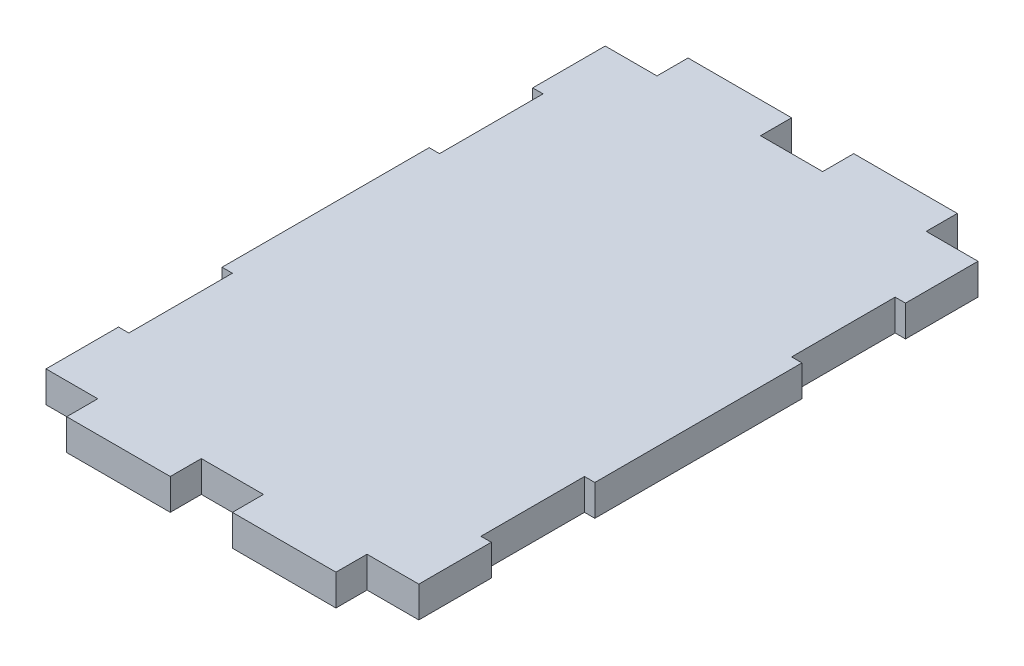
ISO-10303-21;
HEADER;
FILE_DESCRIPTION(('STEP AP214'),'2;1');
FILE_NAME('part.step','',(''),(''),'','','');
FILE_SCHEMA(('AUTOMOTIVE_DESIGN { 1 0 10303 214 1 1 1 1 }'));
ENDSEC;
DATA;
#1=APPLICATION_CONTEXT('core data for automotive mechanical design processes');
#2=APPLICATION_PROTOCOL_DEFINITION('international standard','automotive_design',2000,#1);
#3=PRODUCT_CONTEXT('',#1,'mechanical');
#4=PRODUCT('Part','Part','',(#3));
#5=PRODUCT_RELATED_PRODUCT_CATEGORY('part','',(#4));
#6=PRODUCT_DEFINITION_FORMATION('','',#4);
#7=PRODUCT_DEFINITION_CONTEXT('part definition',#1,'design');
#8=PRODUCT_DEFINITION('design','',#6,#7);
#9=PRODUCT_DEFINITION_SHAPE('','',#8);
#10=(LENGTH_UNIT() NAMED_UNIT(*) SI_UNIT(.MILLI.,.METRE.));
#11=(NAMED_UNIT(*) PLANE_ANGLE_UNIT() SI_UNIT($,.RADIAN.));
#12=(NAMED_UNIT(*) SI_UNIT($,.STERADIAN.) SOLID_ANGLE_UNIT());
#13=UNCERTAINTY_MEASURE_WITH_UNIT(LENGTH_MEASURE(1.E-05),#10,'distance_accuracy_value','');
#14=(GEOMETRIC_REPRESENTATION_CONTEXT(3) GLOBAL_UNCERTAINTY_ASSIGNED_CONTEXT((#13)) GLOBAL_UNIT_ASSIGNED_CONTEXT((#10,
#11,#12)) REPRESENTATION_CONTEXT('',''));
#15=CARTESIAN_POINT('',(0.,0.,0.));
#16=DIRECTION('',(0.,0.,1.));
#17=DIRECTION('',(1.,0.,0.));
#18=AXIS2_PLACEMENT_3D('',#15,#16,#17);
#19=CARTESIAN_POINT('',(0.,3.,-3.));
#20=DIRECTION('',(0.,0.,-1.));
#21=DIRECTION('',(-1.,0.,0.));
#22=AXIS2_PLACEMENT_3D('',#19,#20,#21);
#23=PLANE('',#22);
#24=DIRECTION('',(1.,0.,0.));
#25=VECTOR('',#24,1.);
#26=CARTESIAN_POINT('',(0.,0.,-3.));
#27=LINE('',#26,#25);
#28=CARTESIAN_POINT('',(0.,0.,-3.));
#29=VERTEX_POINT('',#28);
#30=CARTESIAN_POINT('',(5.,0.,-3.));
#31=VERTEX_POINT('',#30);
#32=EDGE_CURVE('E302',#29,#31,#27,.T.);
#33=ORIENTED_EDGE('',*,*,#32,.T.);
#34=DIRECTION('',(0.,-1.,0.));
#35=VECTOR('',#34,1.);
#36=CARTESIAN_POINT('',(5.,3.,-3.));
#37=LINE('',#36,#35);
#38=CARTESIAN_POINT('',(5.,3.,-3.));
#39=VERTEX_POINT('',#38);
#40=EDGE_CURVE('E11',#39,#31,#37,.T.);
#41=ORIENTED_EDGE('',*,*,#40,.F.);
#42=DIRECTION('',(1.,0.,0.));
#43=VECTOR('',#42,1.);
#44=CARTESIAN_POINT('',(0.,3.,-3.));
#45=LINE('',#44,#43);
#46=CARTESIAN_POINT('',(0.,3.,-3.));
#47=VERTEX_POINT('',#46);
#48=EDGE_CURVE('E391',#47,#39,#45,.T.);
#49=ORIENTED_EDGE('',*,*,#48,.F.);
#50=DIRECTION('',(0.,-1.,0.));
#51=VECTOR('',#50,1.);
#52=CARTESIAN_POINT('',(0.,3.,-3.));
#53=LINE('',#52,#51);
#54=EDGE_CURVE('E52',#47,#29,#53,.T.);
#55=ORIENTED_EDGE('',*,*,#54,.T.);
#56=EDGE_LOOP('',(#33,#41,#49,#55));
#57=FACE_BOUND('',#56,.T.);
#58=ADVANCED_FACE('F35',(#57),#23,.F.);
#59=CARTESIAN_POINT('',(5.,3.,0.));
#60=DIRECTION('',(1.,0.,0.));
#61=DIRECTION('',(0.,0.,-1.));
#62=AXIS2_PLACEMENT_3D('',#59,#60,#61);
#63=PLANE('',#62);
#64=DIRECTION('',(0.,0.,1.));
#65=VECTOR('',#64,1.);
#66=CARTESIAN_POINT('',(5.,0.,0.));
#67=LINE('',#66,#65);
#68=CARTESIAN_POINT('',(5.,0.,0.));
#69=VERTEX_POINT('',#68);
#70=EDGE_CURVE('E304',#31,#69,#67,.T.);
#71=ORIENTED_EDGE('',*,*,#70,.T.);
#72=DIRECTION('',(0.,-1.,0.));
#73=VECTOR('',#72,1.);
#74=CARTESIAN_POINT('',(5.,3.,0.));
#75=LINE('',#74,#73);
#76=CARTESIAN_POINT('',(5.,3.,0.));
#77=VERTEX_POINT('',#76);
#78=EDGE_CURVE('E44',#77,#69,#75,.T.);
#79=ORIENTED_EDGE('',*,*,#78,.F.);
#80=DIRECTION('',(0.,0.,1.));
#81=VECTOR('',#80,1.);
#82=CARTESIAN_POINT('',(5.,3.,0.));
#83=LINE('',#82,#81);
#84=EDGE_CURVE('E174',#39,#77,#83,.T.);
#85=ORIENTED_EDGE('',*,*,#84,.F.);
#86=ORIENTED_EDGE('',*,*,#40,.T.);
#87=EDGE_LOOP('',(#71,#79,#85,#86));
#88=FACE_BOUND('',#87,.T.);
#89=ADVANCED_FACE('F37',(#88),#63,.F.);
#90=CARTESIAN_POINT('',(0.,3.,0.));
#91=DIRECTION('',(0.,0.,-1.));
#92=DIRECTION('',(-1.,0.,0.));
#93=AXIS2_PLACEMENT_3D('',#90,#91,#92);
#94=PLANE('',#93);
#95=DIRECTION('',(1.,0.,0.));
#96=VECTOR('',#95,1.);
#97=CARTESIAN_POINT('',(0.,0.,0.));
#98=LINE('',#97,#96);
#99=CARTESIAN_POINT('',(15.,0.,0.));
#100=VERTEX_POINT('',#99);
#101=EDGE_CURVE('E307',#69,#100,#98,.T.);
#102=ORIENTED_EDGE('',*,*,#101,.T.);
#103=DIRECTION('',(0.,-1.,0.));
#104=VECTOR('',#103,1.);
#105=CARTESIAN_POINT('',(15.,3.,0.));
#106=LINE('',#105,#104);
#107=CARTESIAN_POINT('',(15.,3.,0.));
#108=VERTEX_POINT('',#107);
#109=EDGE_CURVE('E459',#108,#100,#106,.T.);
#110=ORIENTED_EDGE('',*,*,#109,.F.);
#111=DIRECTION('',(1.,0.,0.));
#112=VECTOR('',#111,1.);
#113=CARTESIAN_POINT('',(0.,3.,0.));
#114=LINE('',#113,#112);
#115=EDGE_CURVE('E466',#77,#108,#114,.T.);
#116=ORIENTED_EDGE('',*,*,#115,.F.);
#117=ORIENTED_EDGE('',*,*,#78,.T.);
#118=EDGE_LOOP('',(#102,#110,#116,#117));
#119=FACE_BOUND('',#118,.T.);
#120=ADVANCED_FACE('F464',(#119),#94,.F.);
#121=CARTESIAN_POINT('',(15.,3.,0.));
#122=DIRECTION('',(1.,0.,0.));
#123=DIRECTION('',(0.,0.,-1.));
#124=AXIS2_PLACEMENT_3D('',#121,#122,#123);
#125=PLANE('',#124);
#126=DIRECTION('',(0.,0.,1.));
#127=VECTOR('',#126,1.);
#128=CARTESIAN_POINT('',(15.,0.,0.));
#129=LINE('',#128,#127);
#130=CARTESIAN_POINT('',(15.,0.,-3.));
#131=VERTEX_POINT('',#130);
#132=EDGE_CURVE('E310',#131,#100,#129,.T.);
#133=ORIENTED_EDGE('',*,*,#132,.F.);
#134=DIRECTION('',(0.,-1.,0.));
#135=VECTOR('',#134,1.);
#136=CARTESIAN_POINT('',(15.,3.,-3.));
#137=LINE('',#136,#135);
#138=CARTESIAN_POINT('',(15.,3.,-3.));
#139=VERTEX_POINT('',#138);
#140=EDGE_CURVE('E457',#139,#131,#137,.T.);
#141=ORIENTED_EDGE('',*,*,#140,.F.);
#142=DIRECTION('',(0.,0.,1.));
#143=VECTOR('',#142,1.);
#144=CARTESIAN_POINT('',(15.,3.,0.));
#145=LINE('',#144,#143);
#146=EDGE_CURVE('E477',#139,#108,#145,.T.);
#147=ORIENTED_EDGE('',*,*,#146,.T.);
#148=ORIENTED_EDGE('',*,*,#109,.T.);
#149=EDGE_LOOP('',(#133,#141,#147,#148));
#150=FACE_BOUND('',#149,.T.);
#151=ADVANCED_FACE('F473',(#150),#125,.T.);
#152=CARTESIAN_POINT('',(21.,0.,-3.));
#153=VERTEX_POINT('',#152);
#154=EDGE_CURVE('E305',#131,#153,#27,.T.);
#155=ORIENTED_EDGE('',*,*,#154,.T.);
#156=DIRECTION('',(0.,-1.,0.));
#157=VECTOR('',#156,1.);
#158=CARTESIAN_POINT('',(21.,3.,-3.));
#159=LINE('',#158,#157);
#160=CARTESIAN_POINT('',(21.,3.,-3.));
#161=VERTEX_POINT('',#160);
#162=EDGE_CURVE('E454',#161,#153,#159,.T.);
#163=ORIENTED_EDGE('',*,*,#162,.F.);
#164=EDGE_CURVE('E478',#139,#161,#45,.T.);
#165=ORIENTED_EDGE('',*,*,#164,.F.);
#166=ORIENTED_EDGE('',*,*,#140,.T.);
#167=EDGE_LOOP('',(#155,#163,#165,#166));
#168=FACE_BOUND('',#167,.T.);
#169=ADVANCED_FACE('F566',(#168),#23,.F.);
#170=CARTESIAN_POINT('',(21.,3.,0.));
#171=DIRECTION('',(1.,0.,0.));
#172=DIRECTION('',(0.,0.,-1.));
#173=AXIS2_PLACEMENT_3D('',#170,#171,#172);
#174=PLANE('',#173);
#175=DIRECTION('',(0.,0.,1.));
#176=VECTOR('',#175,1.);
#177=CARTESIAN_POINT('',(21.,0.,0.));
#178=LINE('',#177,#176);
#179=CARTESIAN_POINT('',(21.,0.,0.));
#180=VERTEX_POINT('',#179);
#181=EDGE_CURVE('E313',#153,#180,#178,.T.);
#182=ORIENTED_EDGE('',*,*,#181,.T.);
#183=DIRECTION('',(0.,-1.,0.));
#184=VECTOR('',#183,1.);
#185=CARTESIAN_POINT('',(21.,3.,0.));
#186=LINE('',#185,#184);
#187=CARTESIAN_POINT('',(21.,3.,0.));
#188=VERTEX_POINT('',#187);
#189=EDGE_CURVE('E451',#188,#180,#186,.T.);
#190=ORIENTED_EDGE('',*,*,#189,.F.);
#191=DIRECTION('',(0.,0.,1.));
#192=VECTOR('',#191,1.);
#193=CARTESIAN_POINT('',(21.,3.,0.));
#194=LINE('',#193,#192);
#195=EDGE_CURVE('E480',#161,#188,#194,.T.);
#196=ORIENTED_EDGE('',*,*,#195,.F.);
#197=ORIENTED_EDGE('',*,*,#162,.T.);
#198=EDGE_LOOP('',(#182,#190,#196,#197));
#199=FACE_BOUND('',#198,.T.);
#200=ADVANCED_FACE('F573',(#199),#174,.F.);
#201=CARTESIAN_POINT('',(0.,3.,0.));
#202=DIRECTION('',(0.,0.,-1.));
#203=DIRECTION('',(-1.,0.,0.));
#204=AXIS2_PLACEMENT_3D('',#201,#202,#203);
#205=PLANE('',#204);
#206=DIRECTION('',(1.,0.,0.));
#207=VECTOR('',#206,1.);
#208=CARTESIAN_POINT('',(0.,0.,0.));
#209=LINE('',#208,#207);
#210=CARTESIAN_POINT('',(31.,0.,0.));
#211=VERTEX_POINT('',#210);
#212=EDGE_CURVE('E315',#180,#211,#209,.T.);
#213=ORIENTED_EDGE('',*,*,#212,.T.);
#214=DIRECTION('',(0.,-1.,0.));
#215=VECTOR('',#214,1.);
#216=CARTESIAN_POINT('',(31.,3.,0.));
#217=LINE('',#216,#215);
#218=CARTESIAN_POINT('',(31.,3.,0.));
#219=VERTEX_POINT('',#218);
#220=EDGE_CURVE('E449',#219,#211,#217,.T.);
#221=ORIENTED_EDGE('',*,*,#220,.F.);
#222=DIRECTION('',(1.,0.,0.));
#223=VECTOR('',#222,1.);
#224=CARTESIAN_POINT('',(0.,3.,0.));
#225=LINE('',#224,#223);
#226=EDGE_CURVE('E486',#188,#219,#225,.T.);
#227=ORIENTED_EDGE('',*,*,#226,.F.);
#228=ORIENTED_EDGE('',*,*,#189,.T.);
#229=EDGE_LOOP('',(#213,#221,#227,#228));
#230=FACE_BOUND('',#229,.T.);
#231=ADVANCED_FACE('F579',(#230),#205,.F.);
#232=CARTESIAN_POINT('',(31.,3.,0.));
#233=DIRECTION('',(1.,0.,0.));
#234=DIRECTION('',(0.,0.,-1.));
#235=AXIS2_PLACEMENT_3D('',#232,#233,#234);
#236=PLANE('',#235);
#237=DIRECTION('',(0.,0.,1.));
#238=VECTOR('',#237,1.);
#239=CARTESIAN_POINT('',(31.,0.,0.));
#240=LINE('',#239,#238);
#241=CARTESIAN_POINT('',(31.,0.,-3.));
#242=VERTEX_POINT('',#241);
#243=EDGE_CURVE('E318',#242,#211,#240,.T.);
#244=ORIENTED_EDGE('',*,*,#243,.F.);
#245=DIRECTION('',(0.,-1.,0.));
#246=VECTOR('',#245,1.);
#247=CARTESIAN_POINT('',(31.,3.,-3.));
#248=LINE('',#247,#246);
#249=CARTESIAN_POINT('',(31.,3.,-3.));
#250=VERTEX_POINT('',#249);
#251=EDGE_CURVE('E447',#250,#242,#248,.T.);
#252=ORIENTED_EDGE('',*,*,#251,.F.);
#253=DIRECTION('',(0.,0.,1.));
#254=VECTOR('',#253,1.);
#255=CARTESIAN_POINT('',(31.,3.,0.));
#256=LINE('',#255,#254);
#257=EDGE_CURVE('E488',#250,#219,#256,.T.);
#258=ORIENTED_EDGE('',*,*,#257,.T.);
#259=ORIENTED_EDGE('',*,*,#220,.T.);
#260=EDGE_LOOP('',(#244,#252,#258,#259));
#261=FACE_BOUND('',#260,.T.);
#262=ADVANCED_FACE('F743',(#261),#236,.T.);
#263=CARTESIAN_POINT('',(0.,3.,-3.));
#264=DIRECTION('',(0.,0.,1.));
#265=DIRECTION('',(1.,0.,0.));
#266=AXIS2_PLACEMENT_3D('',#263,#264,#265);
#267=PLANE('',#266);
#268=DIRECTION('',(-1.,0.,0.));
#269=VECTOR('',#268,1.);
#270=CARTESIAN_POINT('',(0.,0.,-3.));
#271=LINE('',#270,#269);
#272=CARTESIAN_POINT('',(36.,0.,-3.));
#273=VERTEX_POINT('',#272);
#274=EDGE_CURVE('E321',#273,#242,#271,.T.);
#275=ORIENTED_EDGE('',*,*,#274,.F.);
#276=DIRECTION('',(0.,-1.,0.));
#277=VECTOR('',#276,1.);
#278=CARTESIAN_POINT('',(36.,3.,-3.));
#279=LINE('',#278,#277);
#280=CARTESIAN_POINT('',(36.,3.,-3.));
#281=VERTEX_POINT('',#280);
#282=EDGE_CURVE('E445',#281,#273,#279,.T.);
#283=ORIENTED_EDGE('',*,*,#282,.F.);
#284=DIRECTION('',(-1.,0.,0.));
#285=VECTOR('',#284,1.);
#286=CARTESIAN_POINT('',(0.,3.,-3.));
#287=LINE('',#286,#285);
#288=EDGE_CURVE('E491',#281,#250,#287,.T.);
#289=ORIENTED_EDGE('',*,*,#288,.T.);
#290=ORIENTED_EDGE('',*,*,#251,.T.);
#291=EDGE_LOOP('',(#275,#283,#289,#290));
#292=FACE_BOUND('',#291,.T.);
#293=ADVANCED_FACE('F594',(#292),#267,.T.);
#294=CARTESIAN_POINT('',(36.,3.,0.));
#295=DIRECTION('',(-1.,0.,0.));
#296=DIRECTION('',(0.,0.,1.));
#297=AXIS2_PLACEMENT_3D('',#294,#295,#296);
#298=PLANE('',#297);
#299=DIRECTION('',(0.,0.,-1.));
#300=VECTOR('',#299,1.);
#301=CARTESIAN_POINT('',(36.,0.,0.));
#302=LINE('',#301,#300);
#303=CARTESIAN_POINT('',(36.,0.,-10.));
#304=VERTEX_POINT('',#303);
#305=EDGE_CURVE('E324',#273,#304,#302,.T.);
#306=ORIENTED_EDGE('',*,*,#305,.T.);
#307=DIRECTION('',(0.,-1.,0.));
#308=VECTOR('',#307,1.);
#309=CARTESIAN_POINT('',(36.,3.,-10.));
#310=LINE('',#309,#308);
#311=CARTESIAN_POINT('',(36.,3.,-10.));
#312=VERTEX_POINT('',#311);
#313=EDGE_CURVE('E442',#312,#304,#310,.T.);
#314=ORIENTED_EDGE('',*,*,#313,.F.);
#315=DIRECTION('',(0.,0.,-1.));
#316=VECTOR('',#315,1.);
#317=CARTESIAN_POINT('',(36.,3.,0.));
#318=LINE('',#317,#316);
#319=EDGE_CURVE('E494',#281,#312,#318,.T.);
#320=ORIENTED_EDGE('',*,*,#319,.F.);
#321=ORIENTED_EDGE('',*,*,#282,.T.);
#322=EDGE_LOOP('',(#306,#314,#320,#321));
#323=FACE_BOUND('',#322,.T.);
#324=ADVANCED_FACE('F599',(#323),#298,.F.);
#325=CARTESIAN_POINT('',(0.,3.,-10.));
#326=DIRECTION('',(0.,0.,1.));
#327=DIRECTION('',(1.,0.,0.));
#328=AXIS2_PLACEMENT_3D('',#325,#326,#327);
#329=PLANE('',#328);
#330=DIRECTION('',(-1.,0.,0.));
#331=VECTOR('',#330,1.);
#332=CARTESIAN_POINT('',(0.,0.,-10.));
#333=LINE('',#332,#331);
#334=CARTESIAN_POINT('',(35.,0.,-10.));
#335=VERTEX_POINT('',#334);
#336=EDGE_CURVE('E326',#304,#335,#333,.T.);
#337=ORIENTED_EDGE('',*,*,#336,.T.);
#338=DIRECTION('',(0.,-1.,0.));
#339=VECTOR('',#338,1.);
#340=CARTESIAN_POINT('',(35.,3.,-10.));
#341=LINE('',#340,#339);
#342=CARTESIAN_POINT('',(35.,3.,-10.));
#343=VERTEX_POINT('',#342);
#344=EDGE_CURVE('E439',#343,#335,#341,.T.);
#345=ORIENTED_EDGE('',*,*,#344,.F.);
#346=DIRECTION('',(-1.,0.,0.));
#347=VECTOR('',#346,1.);
#348=CARTESIAN_POINT('',(0.,3.,-10.));
#349=LINE('',#348,#347);
#350=EDGE_CURVE('E496',#312,#343,#349,.T.);
#351=ORIENTED_EDGE('',*,*,#350,.F.);
#352=ORIENTED_EDGE('',*,*,#313,.T.);
#353=EDGE_LOOP('',(#337,#345,#351,#352));
#354=FACE_BOUND('',#353,.T.);
#355=ADVANCED_FACE('F606',(#354),#329,.F.);
#356=CARTESIAN_POINT('',(35.,3.,0.));
#357=DIRECTION('',(-1.,0.,0.));
#358=DIRECTION('',(0.,0.,1.));
#359=AXIS2_PLACEMENT_3D('',#356,#357,#358);
#360=PLANE('',#359);
#361=DIRECTION('',(0.,0.,-1.));
#362=VECTOR('',#361,1.);
#363=CARTESIAN_POINT('',(35.,0.,0.));
#364=LINE('',#363,#362);
#365=CARTESIAN_POINT('',(35.,0.,-20.));
#366=VERTEX_POINT('',#365);
#367=EDGE_CURVE('E328',#335,#366,#364,.T.);
#368=ORIENTED_EDGE('',*,*,#367,.T.);
#369=DIRECTION('',(0.,-1.,0.));
#370=VECTOR('',#369,1.);
#371=CARTESIAN_POINT('',(35.,3.,-20.));
#372=LINE('',#371,#370);
#373=CARTESIAN_POINT('',(35.,3.,-20.));
#374=VERTEX_POINT('',#373);
#375=EDGE_CURVE('E437',#374,#366,#372,.T.);
#376=ORIENTED_EDGE('',*,*,#375,.F.);
#377=DIRECTION('',(0.,0.,-1.));
#378=VECTOR('',#377,1.);
#379=CARTESIAN_POINT('',(35.,3.,0.));
#380=LINE('',#379,#378);
#381=EDGE_CURVE('E498',#343,#374,#380,.T.);
#382=ORIENTED_EDGE('',*,*,#381,.F.);
#383=ORIENTED_EDGE('',*,*,#344,.T.);
#384=EDGE_LOOP('',(#368,#376,#382,#383));
#385=FACE_BOUND('',#384,.T.);
#386=ADVANCED_FACE('F610',(#385),#360,.F.);
#387=CARTESIAN_POINT('',(0.,3.,-20.));
#388=DIRECTION('',(0.,0.,1.));
#389=DIRECTION('',(1.,0.,0.));
#390=AXIS2_PLACEMENT_3D('',#387,#388,#389);
#391=PLANE('',#390);
#392=DIRECTION('',(-1.,0.,0.));
#393=VECTOR('',#392,1.);
#394=CARTESIAN_POINT('',(0.,0.,-20.));
#395=LINE('',#394,#393);
#396=CARTESIAN_POINT('',(36.,0.,-20.));
#397=VERTEX_POINT('',#396);
#398=EDGE_CURVE('E331',#397,#366,#395,.T.);
#399=ORIENTED_EDGE('',*,*,#398,.F.);
#400=DIRECTION('',(0.,-1.,0.));
#401=VECTOR('',#400,1.);
#402=CARTESIAN_POINT('',(36.,3.,-20.));
#403=LINE('',#402,#401);
#404=CARTESIAN_POINT('',(36.,3.,-20.));
#405=VERTEX_POINT('',#404);
#406=EDGE_CURVE('E435',#405,#397,#403,.T.);
#407=ORIENTED_EDGE('',*,*,#406,.F.);
#408=DIRECTION('',(-1.,0.,0.));
#409=VECTOR('',#408,1.);
#410=CARTESIAN_POINT('',(0.,3.,-20.));
#411=LINE('',#410,#409);
#412=EDGE_CURVE('E500',#405,#374,#411,.T.);
#413=ORIENTED_EDGE('',*,*,#412,.T.);
#414=ORIENTED_EDGE('',*,*,#375,.T.);
#415=EDGE_LOOP('',(#399,#407,#413,#414));
#416=FACE_BOUND('',#415,.T.);
#417=ADVANCED_FACE('F613',(#416),#391,.T.);
#418=CARTESIAN_POINT('',(36.,3.,0.));
#419=DIRECTION('',(1.,0.,0.));
#420=DIRECTION('',(0.,0.,-1.));
#421=AXIS2_PLACEMENT_3D('',#418,#419,#420);
#422=PLANE('',#421);
#423=DIRECTION('',(0.,0.,1.));
#424=VECTOR('',#423,1.);
#425=CARTESIAN_POINT('',(36.,0.,0.));
#426=LINE('',#425,#424);
#427=CARTESIAN_POINT('',(36.,0.,-40.));
#428=VERTEX_POINT('',#427);
#429=EDGE_CURVE('E335',#428,#397,#426,.T.);
#430=ORIENTED_EDGE('',*,*,#429,.F.);
#431=DIRECTION('',(0.,-1.,0.));
#432=VECTOR('',#431,1.);
#433=CARTESIAN_POINT('',(36.,3.,-40.));
#434=LINE('',#433,#432);
#435=CARTESIAN_POINT('',(36.,3.,-40.));
#436=VERTEX_POINT('',#435);
#437=EDGE_CURVE('E433',#436,#428,#434,.T.);
#438=ORIENTED_EDGE('',*,*,#437,.F.);
#439=DIRECTION('',(0.,0.,1.));
#440=VECTOR('',#439,1.);
#441=CARTESIAN_POINT('',(36.,3.,0.));
#442=LINE('',#441,#440);
#443=EDGE_CURVE('E504',#436,#405,#442,.T.);
#444=ORIENTED_EDGE('',*,*,#443,.T.);
#445=ORIENTED_EDGE('',*,*,#406,.T.);
#446=EDGE_LOOP('',(#430,#438,#444,#445));
#447=FACE_BOUND('',#446,.T.);
#448=ADVANCED_FACE('F617',(#447),#422,.T.);
#449=CARTESIAN_POINT('',(0.,3.,-40.));
#450=DIRECTION('',(0.,0.,1.));
#451=DIRECTION('',(1.,0.,0.));
#452=AXIS2_PLACEMENT_3D('',#449,#450,#451);
#453=PLANE('',#452);
#454=DIRECTION('',(-1.,0.,0.));
#455=VECTOR('',#454,1.);
#456=CARTESIAN_POINT('',(0.,0.,-40.));
#457=LINE('',#456,#455);
#458=CARTESIAN_POINT('',(35.,0.,-40.));
#459=VERTEX_POINT('',#458);
#460=EDGE_CURVE('E338',#428,#459,#457,.T.);
#461=ORIENTED_EDGE('',*,*,#460,.T.);
#462=DIRECTION('',(0.,-1.,0.));
#463=VECTOR('',#462,1.);
#464=CARTESIAN_POINT('',(35.,3.,-40.));
#465=LINE('',#464,#463);
#466=CARTESIAN_POINT('',(35.,3.,-40.));
#467=VERTEX_POINT('',#466);
#468=EDGE_CURVE('E430',#467,#459,#465,.T.);
#469=ORIENTED_EDGE('',*,*,#468,.F.);
#470=DIRECTION('',(-1.,0.,0.));
#471=VECTOR('',#470,1.);
#472=CARTESIAN_POINT('',(0.,3.,-40.));
#473=LINE('',#472,#471);
#474=EDGE_CURVE('E507',#436,#467,#473,.T.);
#475=ORIENTED_EDGE('',*,*,#474,.F.);
#476=ORIENTED_EDGE('',*,*,#437,.T.);
#477=EDGE_LOOP('',(#461,#469,#475,#476));
#478=FACE_BOUND('',#477,.T.);
#479=ADVANCED_FACE('F622',(#478),#453,.F.);
#480=CARTESIAN_POINT('',(35.,0.,-50.));
#481=VERTEX_POINT('',#480);
#482=EDGE_CURVE('E332',#459,#481,#364,.T.);
#483=ORIENTED_EDGE('',*,*,#482,.T.);
#484=DIRECTION('',(0.,-1.,0.));
#485=VECTOR('',#484,1.);
#486=CARTESIAN_POINT('',(35.,3.,-50.));
#487=LINE('',#486,#485);
#488=CARTESIAN_POINT('',(35.,3.,-50.));
#489=VERTEX_POINT('',#488);
#490=EDGE_CURVE('E428',#489,#481,#487,.T.);
#491=ORIENTED_EDGE('',*,*,#490,.F.);
#492=EDGE_CURVE('E501',#467,#489,#380,.T.);
#493=ORIENTED_EDGE('',*,*,#492,.F.);
#494=ORIENTED_EDGE('',*,*,#468,.T.);
#495=EDGE_LOOP('',(#483,#491,#493,#494));
#496=FACE_BOUND('',#495,.T.);
#497=ADVANCED_FACE('F628',(#496),#360,.F.);
#498=CARTESIAN_POINT('',(0.,3.,-50.));
#499=DIRECTION('',(0.,0.,1.));
#500=DIRECTION('',(1.,0.,0.));
#501=AXIS2_PLACEMENT_3D('',#498,#499,#500);
#502=PLANE('',#501);
#503=DIRECTION('',(-1.,0.,0.));
#504=VECTOR('',#503,1.);
#505=CARTESIAN_POINT('',(0.,0.,-50.));
#506=LINE('',#505,#504);
#507=CARTESIAN_POINT('',(36.,0.,-50.));
#508=VERTEX_POINT('',#507);
#509=EDGE_CURVE('E340',#508,#481,#506,.T.);
#510=ORIENTED_EDGE('',*,*,#509,.F.);
#511=DIRECTION('',(0.,-1.,0.));
#512=VECTOR('',#511,1.);
#513=CARTESIAN_POINT('',(36.,3.,-50.));
#514=LINE('',#513,#512);
#515=CARTESIAN_POINT('',(36.,3.,-50.));
#516=VERTEX_POINT('',#515);
#517=EDGE_CURVE('E426',#516,#508,#514,.T.);
#518=ORIENTED_EDGE('',*,*,#517,.F.);
#519=DIRECTION('',(-1.,0.,0.));
#520=VECTOR('',#519,1.);
#521=CARTESIAN_POINT('',(0.,3.,-50.));
#522=LINE('',#521,#520);
#523=EDGE_CURVE('E509',#516,#489,#522,.T.);
#524=ORIENTED_EDGE('',*,*,#523,.T.);
#525=ORIENTED_EDGE('',*,*,#490,.T.);
#526=EDGE_LOOP('',(#510,#518,#524,#525));
#527=FACE_BOUND('',#526,.T.);
#528=ADVANCED_FACE('F632',(#527),#502,.T.);
#529=CARTESIAN_POINT('',(36.,3.,0.));
#530=DIRECTION('',(-1.,0.,0.));
#531=DIRECTION('',(0.,0.,1.));
#532=AXIS2_PLACEMENT_3D('',#529,#530,#531);
#533=PLANE('',#532);
#534=DIRECTION('',(0.,0.,-1.));
#535=VECTOR('',#534,1.);
#536=CARTESIAN_POINT('',(36.,0.,0.));
#537=LINE('',#536,#535);
#538=CARTESIAN_POINT('',(36.,0.,-57.));
#539=VERTEX_POINT('',#538);
#540=EDGE_CURVE('E343',#508,#539,#537,.T.);
#541=ORIENTED_EDGE('',*,*,#540,.T.);
#542=DIRECTION('',(0.,-1.,0.));
#543=VECTOR('',#542,1.);
#544=CARTESIAN_POINT('',(36.,3.,-57.));
#545=LINE('',#544,#543);
#546=CARTESIAN_POINT('',(36.,3.,-57.));
#547=VERTEX_POINT('',#546);
#548=EDGE_CURVE('E424',#547,#539,#545,.T.);
#549=ORIENTED_EDGE('',*,*,#548,.F.);
#550=DIRECTION('',(0.,0.,-1.));
#551=VECTOR('',#550,1.);
#552=CARTESIAN_POINT('',(36.,3.,0.));
#553=LINE('',#552,#551);
#554=EDGE_CURVE('E512',#516,#547,#553,.T.);
#555=ORIENTED_EDGE('',*,*,#554,.F.);
#556=ORIENTED_EDGE('',*,*,#517,.T.);
#557=EDGE_LOOP('',(#541,#549,#555,#556));
#558=FACE_BOUND('',#557,.T.);
#559=ADVANCED_FACE('F637',(#558),#533,.F.);
#560=CARTESIAN_POINT('',(0.,3.,-57.));
#561=DIRECTION('',(0.,0.,-1.));
#562=DIRECTION('',(-1.,0.,0.));
#563=AXIS2_PLACEMENT_3D('',#560,#561,#562);
#564=PLANE('',#563);
#565=DIRECTION('',(1.,0.,0.));
#566=VECTOR('',#565,1.);
#567=CARTESIAN_POINT('',(0.,0.,-57.));
#568=LINE('',#567,#566);
#569=CARTESIAN_POINT('',(31.,0.,-57.));
#570=VERTEX_POINT('',#569);
#571=EDGE_CURVE('E346',#570,#539,#568,.T.);
#572=ORIENTED_EDGE('',*,*,#571,.F.);
#573=DIRECTION('',(0.,-1.,0.));
#574=VECTOR('',#573,1.);
#575=CARTESIAN_POINT('',(31.,3.,-57.));
#576=LINE('',#575,#574);
#577=CARTESIAN_POINT('',(31.,3.,-57.));
#578=VERTEX_POINT('',#577);
#579=EDGE_CURVE('E422',#578,#570,#576,.T.);
#580=ORIENTED_EDGE('',*,*,#579,.F.);
#581=DIRECTION('',(1.,0.,0.));
#582=VECTOR('',#581,1.);
#583=CARTESIAN_POINT('',(0.,3.,-57.));
#584=LINE('',#583,#582);
#585=EDGE_CURVE('E514',#578,#547,#584,.T.);
#586=ORIENTED_EDGE('',*,*,#585,.T.);
#587=ORIENTED_EDGE('',*,*,#548,.T.);
#588=EDGE_LOOP('',(#572,#580,#586,#587));
#589=FACE_BOUND('',#588,.T.);
#590=ADVANCED_FACE('F644',(#589),#564,.T.);
#591=CARTESIAN_POINT('',(31.,3.,0.));
#592=DIRECTION('',(-1.,0.,0.));
#593=DIRECTION('',(0.,0.,1.));
#594=AXIS2_PLACEMENT_3D('',#591,#592,#593);
#595=PLANE('',#594);
#596=DIRECTION('',(0.,0.,-1.));
#597=VECTOR('',#596,1.);
#598=CARTESIAN_POINT('',(31.,0.,0.));
#599=LINE('',#598,#597);
#600=CARTESIAN_POINT('',(31.,0.,-60.));
#601=VERTEX_POINT('',#600);
#602=EDGE_CURVE('E349',#570,#601,#599,.T.);
#603=ORIENTED_EDGE('',*,*,#602,.T.);
#604=DIRECTION('',(0.,-1.,0.));
#605=VECTOR('',#604,1.);
#606=CARTESIAN_POINT('',(31.,3.,-60.));
#607=LINE('',#606,#605);
#608=CARTESIAN_POINT('',(31.,3.,-60.));
#609=VERTEX_POINT('',#608);
#610=EDGE_CURVE('E420',#609,#601,#607,.T.);
#611=ORIENTED_EDGE('',*,*,#610,.F.);
#612=DIRECTION('',(0.,0.,-1.));
#613=VECTOR('',#612,1.);
#614=CARTESIAN_POINT('',(31.,3.,0.));
#615=LINE('',#614,#613);
#616=EDGE_CURVE('E517',#578,#609,#615,.T.);
#617=ORIENTED_EDGE('',*,*,#616,.F.);
#618=ORIENTED_EDGE('',*,*,#579,.T.);
#619=EDGE_LOOP('',(#603,#611,#617,#618));
#620=FACE_BOUND('',#619,.T.);
#621=ADVANCED_FACE('F647',(#620),#595,.F.);
#622=CARTESIAN_POINT('',(0.,3.,-60.));
#623=DIRECTION('',(0.,0.,-1.));
#624=DIRECTION('',(-1.,0.,0.));
#625=AXIS2_PLACEMENT_3D('',#622,#623,#624);
#626=PLANE('',#625);
#627=DIRECTION('',(1.,0.,0.));
#628=VECTOR('',#627,1.);
#629=CARTESIAN_POINT('',(0.,0.,-60.));
#630=LINE('',#629,#628);
#631=CARTESIAN_POINT('',(21.,0.,-60.));
#632=VERTEX_POINT('',#631);
#633=EDGE_CURVE('E354',#632,#601,#630,.T.);
#634=ORIENTED_EDGE('',*,*,#633,.F.);
#635=DIRECTION('',(0.,-1.,0.));
#636=VECTOR('',#635,1.);
#637=CARTESIAN_POINT('',(21.,3.,-60.));
#638=LINE('',#637,#636);
#639=CARTESIAN_POINT('',(21.,3.,-60.));
#640=VERTEX_POINT('',#639);
#641=EDGE_CURVE('E418',#640,#632,#638,.T.);
#642=ORIENTED_EDGE('',*,*,#641,.F.);
#643=DIRECTION('',(1.,0.,0.));
#644=VECTOR('',#643,1.);
#645=CARTESIAN_POINT('',(0.,3.,-60.));
#646=LINE('',#645,#644);
#647=EDGE_CURVE('E521',#640,#609,#646,.T.);
#648=ORIENTED_EDGE('',*,*,#647,.T.);
#649=ORIENTED_EDGE('',*,*,#610,.T.);
#650=EDGE_LOOP('',(#634,#642,#648,#649));
#651=FACE_BOUND('',#650,.T.);
#652=ADVANCED_FACE('F650',(#651),#626,.T.);
#653=CARTESIAN_POINT('',(21.,3.,0.));
#654=DIRECTION('',(-1.,0.,0.));
#655=DIRECTION('',(0.,0.,1.));
#656=AXIS2_PLACEMENT_3D('',#653,#654,#655);
#657=PLANE('',#656);
#658=DIRECTION('',(0.,0.,-1.));
#659=VECTOR('',#658,1.);
#660=CARTESIAN_POINT('',(21.,0.,0.));
#661=LINE('',#660,#659);
#662=CARTESIAN_POINT('',(21.,0.,-57.));
#663=VERTEX_POINT('',#662);
#664=EDGE_CURVE('E357',#663,#632,#661,.T.);
#665=ORIENTED_EDGE('',*,*,#664,.F.);
#666=DIRECTION('',(0.,-1.,0.));
#667=VECTOR('',#666,1.);
#668=CARTESIAN_POINT('',(21.,3.,-57.));
#669=LINE('',#668,#667);
#670=CARTESIAN_POINT('',(21.,3.,-57.));
#671=VERTEX_POINT('',#670);
#672=EDGE_CURVE('E416',#671,#663,#669,.T.);
#673=ORIENTED_EDGE('',*,*,#672,.F.);
#674=DIRECTION('',(0.,0.,-1.));
#675=VECTOR('',#674,1.);
#676=CARTESIAN_POINT('',(21.,3.,0.));
#677=LINE('',#676,#675);
#678=EDGE_CURVE('E524',#671,#640,#677,.T.);
#679=ORIENTED_EDGE('',*,*,#678,.T.);
#680=ORIENTED_EDGE('',*,*,#641,.T.);
#681=EDGE_LOOP('',(#665,#673,#679,#680));
#682=FACE_BOUND('',#681,.T.);
#683=ADVANCED_FACE('F656',(#682),#657,.T.);
#684=CARTESIAN_POINT('',(15.,0.,-57.));
#685=VERTEX_POINT('',#684);
#686=EDGE_CURVE('E351',#685,#663,#568,.T.);
#687=ORIENTED_EDGE('',*,*,#686,.F.);
#688=DIRECTION('',(0.,-1.,0.));
#689=VECTOR('',#688,1.);
#690=CARTESIAN_POINT('',(15.,3.,-57.));
#691=LINE('',#690,#689);
#692=CARTESIAN_POINT('',(15.,3.,-57.));
#693=VERTEX_POINT('',#692);
#694=EDGE_CURVE('E414',#693,#685,#691,.T.);
#695=ORIENTED_EDGE('',*,*,#694,.F.);
#696=EDGE_CURVE('E519',#693,#671,#584,.T.);
#697=ORIENTED_EDGE('',*,*,#696,.T.);
#698=ORIENTED_EDGE('',*,*,#672,.T.);
#699=EDGE_LOOP('',(#687,#695,#697,#698));
#700=FACE_BOUND('',#699,.T.);
#701=ADVANCED_FACE('F660',(#700),#564,.T.);
#702=CARTESIAN_POINT('',(15.,3.,0.));
#703=DIRECTION('',(-1.,0.,0.));
#704=DIRECTION('',(0.,0.,1.));
#705=AXIS2_PLACEMENT_3D('',#702,#703,#704);
#706=PLANE('',#705);
#707=DIRECTION('',(0.,0.,-1.));
#708=VECTOR('',#707,1.);
#709=CARTESIAN_POINT('',(15.,0.,0.));
#710=LINE('',#709,#708);
#711=CARTESIAN_POINT('',(15.,0.,-60.));
#712=VERTEX_POINT('',#711);
#713=EDGE_CURVE('E360',#685,#712,#710,.T.);
#714=ORIENTED_EDGE('',*,*,#713,.T.);
#715=DIRECTION('',(0.,-1.,0.));
#716=VECTOR('',#715,1.);
#717=CARTESIAN_POINT('',(15.,3.,-60.));
#718=LINE('',#717,#716);
#719=CARTESIAN_POINT('',(15.,3.,-60.));
#720=VERTEX_POINT('',#719);
#721=EDGE_CURVE('E412',#720,#712,#718,.T.);
#722=ORIENTED_EDGE('',*,*,#721,.F.);
#723=DIRECTION('',(0.,0.,-1.));
#724=VECTOR('',#723,1.);
#725=CARTESIAN_POINT('',(15.,3.,0.));
#726=LINE('',#725,#724);
#727=EDGE_CURVE('E527',#693,#720,#726,.T.);
#728=ORIENTED_EDGE('',*,*,#727,.F.);
#729=ORIENTED_EDGE('',*,*,#694,.T.);
#730=EDGE_LOOP('',(#714,#722,#728,#729));
#731=FACE_BOUND('',#730,.T.);
#732=ADVANCED_FACE('F714',(#731),#706,.F.);
#733=CARTESIAN_POINT('',(0.,3.,-60.));
#734=DIRECTION('',(0.,0.,-1.));
#735=DIRECTION('',(-1.,0.,0.));
#736=AXIS2_PLACEMENT_3D('',#733,#734,#735);
#737=PLANE('',#736);
#738=DIRECTION('',(1.,0.,0.));
#739=VECTOR('',#738,1.);
#740=CARTESIAN_POINT('',(0.,0.,-60.));
#741=LINE('',#740,#739);
#742=CARTESIAN_POINT('',(5.,0.,-60.));
#743=VERTEX_POINT('',#742);
#744=EDGE_CURVE('E363',#743,#712,#741,.T.);
#745=ORIENTED_EDGE('',*,*,#744,.F.);
#746=DIRECTION('',(0.,-1.,0.));
#747=VECTOR('',#746,1.);
#748=CARTESIAN_POINT('',(5.,3.,-60.));
#749=LINE('',#748,#747);
#750=CARTESIAN_POINT('',(5.,3.,-60.));
#751=VERTEX_POINT('',#750);
#752=EDGE_CURVE('E410',#751,#743,#749,.T.);
#753=ORIENTED_EDGE('',*,*,#752,.F.);
#754=DIRECTION('',(1.,0.,0.));
#755=VECTOR('',#754,1.);
#756=CARTESIAN_POINT('',(0.,3.,-60.));
#757=LINE('',#756,#755);
#758=EDGE_CURVE('E529',#751,#720,#757,.T.);
#759=ORIENTED_EDGE('',*,*,#758,.T.);
#760=ORIENTED_EDGE('',*,*,#721,.T.);
#761=EDGE_LOOP('',(#745,#753,#759,#760));
#762=FACE_BOUND('',#761,.T.);
#763=ADVANCED_FACE('F710',(#762),#737,.T.);
#764=CARTESIAN_POINT('',(5.,3.,0.));
#765=DIRECTION('',(-1.,0.,0.));
#766=DIRECTION('',(0.,0.,1.));
#767=AXIS2_PLACEMENT_3D('',#764,#765,#766);
#768=PLANE('',#767);
#769=DIRECTION('',(0.,0.,-1.));
#770=VECTOR('',#769,1.);
#771=CARTESIAN_POINT('',(5.,0.,0.));
#772=LINE('',#771,#770);
#773=CARTESIAN_POINT('',(5.,0.,-57.));
#774=VERTEX_POINT('',#773);
#775=EDGE_CURVE('E366',#774,#743,#772,.T.);
#776=ORIENTED_EDGE('',*,*,#775,.F.);
#777=DIRECTION('',(0.,-1.,0.));
#778=VECTOR('',#777,1.);
#779=CARTESIAN_POINT('',(5.,3.,-57.));
#780=LINE('',#779,#778);
#781=CARTESIAN_POINT('',(5.,3.,-57.));
#782=VERTEX_POINT('',#781);
#783=EDGE_CURVE('E408',#782,#774,#780,.T.);
#784=ORIENTED_EDGE('',*,*,#783,.F.);
#785=DIRECTION('',(0.,0.,-1.));
#786=VECTOR('',#785,1.);
#787=CARTESIAN_POINT('',(5.,3.,0.));
#788=LINE('',#787,#786);
#789=EDGE_CURVE('E532',#782,#751,#788,.T.);
#790=ORIENTED_EDGE('',*,*,#789,.T.);
#791=ORIENTED_EDGE('',*,*,#752,.T.);
#792=EDGE_LOOP('',(#776,#784,#790,#791));
#793=FACE_BOUND('',#792,.T.);
#794=ADVANCED_FACE('F707',(#793),#768,.T.);
#795=CARTESIAN_POINT('',(0.,0.,-57.));
#796=VERTEX_POINT('',#795);
#797=EDGE_CURVE('E350',#796,#774,#568,.T.);
#798=ORIENTED_EDGE('',*,*,#797,.F.);
#799=DIRECTION('',(0.,-1.,0.));
#800=VECTOR('',#799,1.);
#801=CARTESIAN_POINT('',(0.,3.,-57.));
#802=LINE('',#801,#800);
#803=CARTESIAN_POINT('',(0.,3.,-57.));
#804=VERTEX_POINT('',#803);
#805=EDGE_CURVE('E406',#804,#796,#802,.T.);
#806=ORIENTED_EDGE('',*,*,#805,.F.);
#807=EDGE_CURVE('E518',#804,#782,#584,.T.);
#808=ORIENTED_EDGE('',*,*,#807,.T.);
#809=ORIENTED_EDGE('',*,*,#783,.T.);
#810=EDGE_LOOP('',(#798,#806,#808,#809));
#811=FACE_BOUND('',#810,.T.);
#812=ADVANCED_FACE('F666',(#811),#564,.T.);
#813=CARTESIAN_POINT('',(0.,3.,0.));
#814=DIRECTION('',(-1.,0.,0.));
#815=DIRECTION('',(0.,0.,1.));
#816=AXIS2_PLACEMENT_3D('',#813,#814,#815);
#817=PLANE('',#816);
#818=DIRECTION('',(0.,0.,-1.));
#819=VECTOR('',#818,1.);
#820=CARTESIAN_POINT('',(0.,0.,0.));
#821=LINE('',#820,#819);
#822=CARTESIAN_POINT('',(0.,0.,-50.));
#823=VERTEX_POINT('',#822);
#824=EDGE_CURVE('E369',#823,#796,#821,.T.);
#825=ORIENTED_EDGE('',*,*,#824,.F.);
#826=DIRECTION('',(0.,-1.,0.));
#827=VECTOR('',#826,1.);
#828=CARTESIAN_POINT('',(0.,3.,-50.));
#829=LINE('',#828,#827);
#830=CARTESIAN_POINT('',(0.,3.,-50.));
#831=VERTEX_POINT('',#830);
#832=EDGE_CURVE('E404',#831,#823,#829,.T.);
#833=ORIENTED_EDGE('',*,*,#832,.F.);
#834=DIRECTION('',(0.,0.,-1.));
#835=VECTOR('',#834,1.);
#836=CARTESIAN_POINT('',(0.,3.,0.));
#837=LINE('',#836,#835);
#838=EDGE_CURVE('E535',#831,#804,#837,.T.);
#839=ORIENTED_EDGE('',*,*,#838,.T.);
#840=ORIENTED_EDGE('',*,*,#805,.T.);
#841=EDGE_LOOP('',(#825,#833,#839,#840));
#842=FACE_BOUND('',#841,.T.);
#843=ADVANCED_FACE('F673',(#842),#817,.T.);
#844=CARTESIAN_POINT('',(0.,3.,-50.));
#845=DIRECTION('',(0.,0.,-1.));
#846=DIRECTION('',(-1.,0.,0.));
#847=AXIS2_PLACEMENT_3D('',#844,#845,#846);
#848=PLANE('',#847);
#849=DIRECTION('',(1.,0.,0.));
#850=VECTOR('',#849,1.);
#851=CARTESIAN_POINT('',(0.,0.,-50.));
#852=LINE('',#851,#850);
#853=CARTESIAN_POINT('',(1.,0.,-50.));
#854=VERTEX_POINT('',#853);
#855=EDGE_CURVE('E372',#823,#854,#852,.T.);
#856=ORIENTED_EDGE('',*,*,#855,.T.);
#857=DIRECTION('',(0.,-1.,0.));
#858=VECTOR('',#857,1.);
#859=CARTESIAN_POINT('',(1.,3.,-50.));
#860=LINE('',#859,#858);
#861=CARTESIAN_POINT('',(1.,3.,-50.));
#862=VERTEX_POINT('',#861);
#863=EDGE_CURVE('E402',#862,#854,#860,.T.);
#864=ORIENTED_EDGE('',*,*,#863,.F.);
#865=DIRECTION('',(1.,0.,0.));
#866=VECTOR('',#865,1.);
#867=CARTESIAN_POINT('',(0.,3.,-50.));
#868=LINE('',#867,#866);
#869=EDGE_CURVE('E538',#831,#862,#868,.T.);
#870=ORIENTED_EDGE('',*,*,#869,.F.);
#871=ORIENTED_EDGE('',*,*,#832,.T.);
#872=EDGE_LOOP('',(#856,#864,#870,#871));
#873=FACE_BOUND('',#872,.T.);
#874=ADVANCED_FACE('F678',(#873),#848,.F.);
#875=CARTESIAN_POINT('',(1.,3.,0.));
#876=DIRECTION('',(-1.,0.,0.));
#877=DIRECTION('',(0.,0.,1.));
#878=AXIS2_PLACEMENT_3D('',#875,#876,#877);
#879=PLANE('',#878);
#880=DIRECTION('',(0.,0.,-1.));
#881=VECTOR('',#880,1.);
#882=CARTESIAN_POINT('',(1.,0.,0.));
#883=LINE('',#882,#881);
#884=CARTESIAN_POINT('',(1.,0.,-40.));
#885=VERTEX_POINT('',#884);
#886=EDGE_CURVE('E375',#885,#854,#883,.T.);
#887=ORIENTED_EDGE('',*,*,#886,.F.);
#888=DIRECTION('',(0.,-1.,0.));
#889=VECTOR('',#888,1.);
#890=CARTESIAN_POINT('',(1.,3.,-40.));
#891=LINE('',#890,#889);
#892=CARTESIAN_POINT('',(1.,3.,-40.));
#893=VERTEX_POINT('',#892);
#894=EDGE_CURVE('E400',#893,#885,#891,.T.);
#895=ORIENTED_EDGE('',*,*,#894,.F.);
#896=DIRECTION('',(0.,0.,-1.));
#897=VECTOR('',#896,1.);
#898=CARTESIAN_POINT('',(1.,3.,0.));
#899=LINE('',#898,#897);
#900=EDGE_CURVE('E294',#893,#862,#899,.T.);
#901=ORIENTED_EDGE('',*,*,#900,.T.);
#902=ORIENTED_EDGE('',*,*,#863,.T.);
#903=EDGE_LOOP('',(#887,#895,#901,#902));
#904=FACE_BOUND('',#903,.T.);
#905=ADVANCED_FACE('F684',(#904),#879,.T.);
#906=CARTESIAN_POINT('',(0.,3.,-40.));
#907=DIRECTION('',(0.,0.,-1.));
#908=DIRECTION('',(-1.,0.,0.));
#909=AXIS2_PLACEMENT_3D('',#906,#907,#908);
#910=PLANE('',#909);
#911=DIRECTION('',(1.,0.,0.));
#912=VECTOR('',#911,1.);
#913=CARTESIAN_POINT('',(0.,0.,-40.));
#914=LINE('',#913,#912);
#915=CARTESIAN_POINT('',(0.,0.,-40.));
#916=VERTEX_POINT('',#915);
#917=EDGE_CURVE('E378',#916,#885,#914,.T.);
#918=ORIENTED_EDGE('',*,*,#917,.F.);
#919=DIRECTION('',(0.,-1.,0.));
#920=VECTOR('',#919,1.);
#921=CARTESIAN_POINT('',(0.,3.,-40.));
#922=LINE('',#921,#920);
#923=CARTESIAN_POINT('',(0.,3.,-40.));
#924=VERTEX_POINT('',#923);
#925=EDGE_CURVE('E398',#924,#916,#922,.T.);
#926=ORIENTED_EDGE('',*,*,#925,.F.);
#927=DIRECTION('',(1.,0.,0.));
#928=VECTOR('',#927,1.);
#929=CARTESIAN_POINT('',(0.,3.,-40.));
#930=LINE('',#929,#928);
#931=EDGE_CURVE('E541',#924,#893,#930,.T.);
#932=ORIENTED_EDGE('',*,*,#931,.T.);
#933=ORIENTED_EDGE('',*,*,#894,.T.);
#934=EDGE_LOOP('',(#918,#926,#932,#933));
#935=FACE_BOUND('',#934,.T.);
#936=ADVANCED_FACE('F682',(#935),#910,.T.);
#937=CARTESIAN_POINT('',(0.,3.,0.));
#938=DIRECTION('',(1.,0.,0.));
#939=DIRECTION('',(0.,0.,-1.));
#940=AXIS2_PLACEMENT_3D('',#937,#938,#939);
#941=PLANE('',#940);
#942=DIRECTION('',(0.,0.,1.));
#943=VECTOR('',#942,1.);
#944=CARTESIAN_POINT('',(0.,0.,0.));
#945=LINE('',#944,#943);
#946=CARTESIAN_POINT('',(0.,0.,-20.));
#947=VERTEX_POINT('',#946);
#948=EDGE_CURVE('E381',#916,#947,#945,.T.);
#949=ORIENTED_EDGE('',*,*,#948,.T.);
#950=DIRECTION('',(0.,-1.,0.));
#951=VECTOR('',#950,1.);
#952=CARTESIAN_POINT('',(0.,3.,-20.));
#953=LINE('',#952,#951);
#954=CARTESIAN_POINT('',(0.,3.,-20.));
#955=VERTEX_POINT('',#954);
#956=EDGE_CURVE('E395',#955,#947,#953,.T.);
#957=ORIENTED_EDGE('',*,*,#956,.F.);
#958=DIRECTION('',(0.,0.,1.));
#959=VECTOR('',#958,1.);
#960=CARTESIAN_POINT('',(0.,3.,0.));
#961=LINE('',#960,#959);
#962=EDGE_CURVE('E543',#924,#955,#961,.T.);
#963=ORIENTED_EDGE('',*,*,#962,.F.);
#964=ORIENTED_EDGE('',*,*,#925,.T.);
#965=EDGE_LOOP('',(#949,#957,#963,#964));
#966=FACE_BOUND('',#965,.T.);
#967=ADVANCED_FACE('F549',(#966),#941,.F.);
#968=CARTESIAN_POINT('',(0.,3.,-20.));
#969=DIRECTION('',(0.,0.,-1.));
#970=DIRECTION('',(-1.,0.,0.));
#971=AXIS2_PLACEMENT_3D('',#968,#969,#970);
#972=PLANE('',#971);
#973=DIRECTION('',(1.,0.,0.));
#974=VECTOR('',#973,1.);
#975=CARTESIAN_POINT('',(0.,0.,-20.));
#976=LINE('',#975,#974);
#977=CARTESIAN_POINT('',(1.,0.,-20.));
#978=VERTEX_POINT('',#977);
#979=EDGE_CURVE('E383',#947,#978,#976,.T.);
#980=ORIENTED_EDGE('',*,*,#979,.T.);
#981=DIRECTION('',(0.,-1.,0.));
#982=VECTOR('',#981,1.);
#983=CARTESIAN_POINT('',(1.,3.,-20.));
#984=LINE('',#983,#982);
#985=CARTESIAN_POINT('',(1.,3.,-20.));
#986=VERTEX_POINT('',#985);
#987=EDGE_CURVE('E283',#986,#978,#984,.T.);
#988=ORIENTED_EDGE('',*,*,#987,.F.);
#989=DIRECTION('',(1.,0.,0.));
#990=VECTOR('',#989,1.);
#991=CARTESIAN_POINT('',(0.,3.,-20.));
#992=LINE('',#991,#990);
#993=EDGE_CURVE('E291',#955,#986,#992,.T.);
#994=ORIENTED_EDGE('',*,*,#993,.F.);
#995=ORIENTED_EDGE('',*,*,#956,.T.);
#996=EDGE_LOOP('',(#980,#988,#994,#995));
#997=FACE_BOUND('',#996,.T.);
#998=ADVANCED_FACE('F553',(#997),#972,.F.);
#999=CARTESIAN_POINT('',(1.,0.,-10.));
#1000=VERTEX_POINT('',#999);
#1001=EDGE_CURVE('E279',#1000,#978,#883,.T.);
#1002=ORIENTED_EDGE('',*,*,#1001,.F.);
#1003=DIRECTION('',(0.,-1.,0.));
#1004=VECTOR('',#1003,1.);
#1005=CARTESIAN_POINT('',(1.,3.,-10.));
#1006=LINE('',#1005,#1004);
#1007=CARTESIAN_POINT('',(1.,3.,-10.));
#1008=VERTEX_POINT('',#1007);
#1009=EDGE_CURVE('E274',#1008,#1000,#1006,.T.);
#1010=ORIENTED_EDGE('',*,*,#1009,.F.);
#1011=EDGE_CURVE('E277',#1008,#986,#899,.T.);
#1012=ORIENTED_EDGE('',*,*,#1011,.T.);
#1013=ORIENTED_EDGE('',*,*,#987,.T.);
#1014=EDGE_LOOP('',(#1002,#1010,#1012,#1013));
#1015=FACE_BOUND('',#1014,.T.);
#1016=ADVANCED_FACE('F276',(#1015),#879,.T.);
#1017=CARTESIAN_POINT('',(0.,3.,-10.));
#1018=DIRECTION('',(0.,0.,-1.));
#1019=DIRECTION('',(-1.,0.,0.));
#1020=AXIS2_PLACEMENT_3D('',#1017,#1018,#1019);
#1021=PLANE('',#1020);
#1022=DIRECTION('',(1.,0.,0.));
#1023=VECTOR('',#1022,1.);
#1024=CARTESIAN_POINT('',(0.,0.,-10.));
#1025=LINE('',#1024,#1023);
#1026=CARTESIAN_POINT('',(0.,0.,-10.));
#1027=VERTEX_POINT('',#1026);
#1028=EDGE_CURVE('E386',#1027,#1000,#1025,.T.);
#1029=ORIENTED_EDGE('',*,*,#1028,.F.);
#1030=DIRECTION('',(0.,-1.,0.));
#1031=VECTOR('',#1030,1.);
#1032=CARTESIAN_POINT('',(0.,3.,-10.));
#1033=LINE('',#1032,#1031);
#1034=CARTESIAN_POINT('',(0.,3.,-10.));
#1035=VERTEX_POINT('',#1034);
#1036=EDGE_CURVE('E162',#1035,#1027,#1033,.T.);
#1037=ORIENTED_EDGE('',*,*,#1036,.F.);
#1038=DIRECTION('',(1.,0.,0.));
#1039=VECTOR('',#1038,1.);
#1040=CARTESIAN_POINT('',(0.,3.,-10.));
#1041=LINE('',#1040,#1039);
#1042=EDGE_CURVE('E289',#1035,#1008,#1041,.T.);
#1043=ORIENTED_EDGE('',*,*,#1042,.T.);
#1044=ORIENTED_EDGE('',*,*,#1009,.T.);
#1045=EDGE_LOOP('',(#1029,#1037,#1043,#1044));
#1046=FACE_BOUND('',#1045,.T.);
#1047=ADVANCED_FACE('F295',(#1046),#1021,.T.);
#1048=CARTESIAN_POINT('',(0.,3.,0.));
#1049=DIRECTION('',(-1.,0.,0.));
#1050=DIRECTION('',(0.,0.,1.));
#1051=AXIS2_PLACEMENT_3D('',#1048,#1049,#1050);
#1052=PLANE('',#1051);
#1053=DIRECTION('',(0.,0.,-1.));
#1054=VECTOR('',#1053,1.);
#1055=CARTESIAN_POINT('',(0.,0.,0.));
#1056=LINE('',#1055,#1054);
#1057=EDGE_CURVE('E388',#29,#1027,#1056,.T.);
#1058=ORIENTED_EDGE('',*,*,#1057,.F.);
#1059=ORIENTED_EDGE('',*,*,#54,.F.);
#1060=DIRECTION('',(0.,0.,-1.));
#1061=VECTOR('',#1060,1.);
#1062=CARTESIAN_POINT('',(0.,3.,0.));
#1063=LINE('',#1062,#1061);
#1064=EDGE_CURVE('E296',#47,#1035,#1063,.T.);
#1065=ORIENTED_EDGE('',*,*,#1064,.T.);
#1066=ORIENTED_EDGE('',*,*,#1036,.T.);
#1067=EDGE_LOOP('',(#1058,#1059,#1065,#1066));
#1068=FACE_BOUND('',#1067,.T.);
#1069=ADVANCED_FACE('F554',(#1068),#1052,.T.);
#1070=CARTESIAN_POINT('',(0.,3.,0.));
#1071=DIRECTION('',(0.,1.,0.));
#1072=DIRECTION('',(0.,0.,1.));
#1073=AXIS2_PLACEMENT_3D('',#1070,#1071,#1072);
#1074=PLANE('',#1073);
#1075=ORIENTED_EDGE('',*,*,#48,.T.);
#1076=ORIENTED_EDGE('',*,*,#84,.T.);
#1077=ORIENTED_EDGE('',*,*,#115,.T.);
#1078=ORIENTED_EDGE('',*,*,#146,.F.);
#1079=ORIENTED_EDGE('',*,*,#164,.T.);
#1080=ORIENTED_EDGE('',*,*,#195,.T.);
#1081=ORIENTED_EDGE('',*,*,#226,.T.);
#1082=ORIENTED_EDGE('',*,*,#257,.F.);
#1083=ORIENTED_EDGE('',*,*,#288,.F.);
#1084=ORIENTED_EDGE('',*,*,#319,.T.);
#1085=ORIENTED_EDGE('',*,*,#350,.T.);
#1086=ORIENTED_EDGE('',*,*,#381,.T.);
#1087=ORIENTED_EDGE('',*,*,#412,.F.);
#1088=ORIENTED_EDGE('',*,*,#443,.F.);
#1089=ORIENTED_EDGE('',*,*,#474,.T.);
#1090=ORIENTED_EDGE('',*,*,#492,.T.);
#1091=ORIENTED_EDGE('',*,*,#523,.F.);
#1092=ORIENTED_EDGE('',*,*,#554,.T.);
#1093=ORIENTED_EDGE('',*,*,#585,.F.);
#1094=ORIENTED_EDGE('',*,*,#616,.T.);
#1095=ORIENTED_EDGE('',*,*,#647,.F.);
#1096=ORIENTED_EDGE('',*,*,#678,.F.);
#1097=ORIENTED_EDGE('',*,*,#696,.F.);
#1098=ORIENTED_EDGE('',*,*,#727,.T.);
#1099=ORIENTED_EDGE('',*,*,#758,.F.);
#1100=ORIENTED_EDGE('',*,*,#789,.F.);
#1101=ORIENTED_EDGE('',*,*,#807,.F.);
#1102=ORIENTED_EDGE('',*,*,#838,.F.);
#1103=ORIENTED_EDGE('',*,*,#869,.T.);
#1104=ORIENTED_EDGE('',*,*,#900,.F.);
#1105=ORIENTED_EDGE('',*,*,#931,.F.);
#1106=ORIENTED_EDGE('',*,*,#962,.T.);
#1107=ORIENTED_EDGE('',*,*,#993,.T.);
#1108=ORIENTED_EDGE('',*,*,#1011,.F.);
#1109=ORIENTED_EDGE('',*,*,#1042,.F.);
#1110=ORIENTED_EDGE('',*,*,#1064,.F.);
#1111=EDGE_LOOP('',(#1075,#1076,#1077,#1078,#1079,#1080,#1081,#1082,#1083,#1084,#1085,#1086,
#1087,#1088,#1089,#1090,#1091,#1092,#1093,#1094,#1095,#1096,#1097,#1098,#1099,#1100,#1101,#1102,
#1103,#1104,#1105,#1106,#1107,#1108,#1109,#1110));
#1112=FACE_BOUND('',#1111,.T.);
#1113=ADVANCED_FACE('F287',(#1112),#1074,.T.);
#1114=CARTESIAN_POINT('',(0.,0.,0.));
#1115=DIRECTION('',(0.,1.,0.));
#1116=DIRECTION('',(0.,0.,1.));
#1117=AXIS2_PLACEMENT_3D('',#1114,#1115,#1116);
#1118=PLANE('',#1117);
#1119=ORIENTED_EDGE('',*,*,#32,.F.);
#1120=ORIENTED_EDGE('',*,*,#1057,.T.);
#1121=ORIENTED_EDGE('',*,*,#1028,.T.);
#1122=ORIENTED_EDGE('',*,*,#1001,.T.);
#1123=ORIENTED_EDGE('',*,*,#979,.F.);
#1124=ORIENTED_EDGE('',*,*,#948,.F.);
#1125=ORIENTED_EDGE('',*,*,#917,.T.);
#1126=ORIENTED_EDGE('',*,*,#886,.T.);
#1127=ORIENTED_EDGE('',*,*,#855,.F.);
#1128=ORIENTED_EDGE('',*,*,#824,.T.);
#1129=ORIENTED_EDGE('',*,*,#797,.T.);
#1130=ORIENTED_EDGE('',*,*,#775,.T.);
#1131=ORIENTED_EDGE('',*,*,#744,.T.);
#1132=ORIENTED_EDGE('',*,*,#713,.F.);
#1133=ORIENTED_EDGE('',*,*,#686,.T.);
#1134=ORIENTED_EDGE('',*,*,#664,.T.);
#1135=ORIENTED_EDGE('',*,*,#633,.T.);
#1136=ORIENTED_EDGE('',*,*,#602,.F.);
#1137=ORIENTED_EDGE('',*,*,#571,.T.);
#1138=ORIENTED_EDGE('',*,*,#540,.F.);
#1139=ORIENTED_EDGE('',*,*,#509,.T.);
#1140=ORIENTED_EDGE('',*,*,#482,.F.);
#1141=ORIENTED_EDGE('',*,*,#460,.F.);
#1142=ORIENTED_EDGE('',*,*,#429,.T.);
#1143=ORIENTED_EDGE('',*,*,#398,.T.);
#1144=ORIENTED_EDGE('',*,*,#367,.F.);
#1145=ORIENTED_EDGE('',*,*,#336,.F.);
#1146=ORIENTED_EDGE('',*,*,#305,.F.);
#1147=ORIENTED_EDGE('',*,*,#274,.T.);
#1148=ORIENTED_EDGE('',*,*,#243,.T.);
#1149=ORIENTED_EDGE('',*,*,#212,.F.);
#1150=ORIENTED_EDGE('',*,*,#181,.F.);
#1151=ORIENTED_EDGE('',*,*,#154,.F.);
#1152=ORIENTED_EDGE('',*,*,#132,.T.);
#1153=ORIENTED_EDGE('',*,*,#101,.F.);
#1154=ORIENTED_EDGE('',*,*,#70,.F.);
#1155=EDGE_LOOP('',(#1119,#1120,#1121,#1122,#1123,#1124,#1125,#1126,#1127,#1128,#1129,#1130,
#1131,#1132,#1133,#1134,#1135,#1136,#1137,#1138,#1139,#1140,#1141,#1142,#1143,#1144,#1145,#1146,
#1147,#1148,#1149,#1150,#1151,#1152,#1153,#1154));
#1156=FACE_BOUND('',#1155,.T.);
#1157=ADVANCED_FACE('F468',(#1156),#1118,.F.);
#1158=CLOSED_SHELL('',(#58,#89,#120,#151,#169,#200,#231,#262,#293,#324,#355,#386,#417,#448,#479,
#497,#528,#559,#590,#621,#652,#683,#701,#732,#763,#794,#812,#843,#874,#905,#936,#967,#998,#1016,
#1047,#1069,#1113,#1157));
#1159=MANIFOLD_SOLID_BREP('B2',#1158);
#1160=ADVANCED_BREP_SHAPE_REPRESENTATION('',(#18,#1159),#14);
#1161=SHAPE_DEFINITION_REPRESENTATION(#9,#1160);
ENDSEC;
END-ISO-10303-21;
